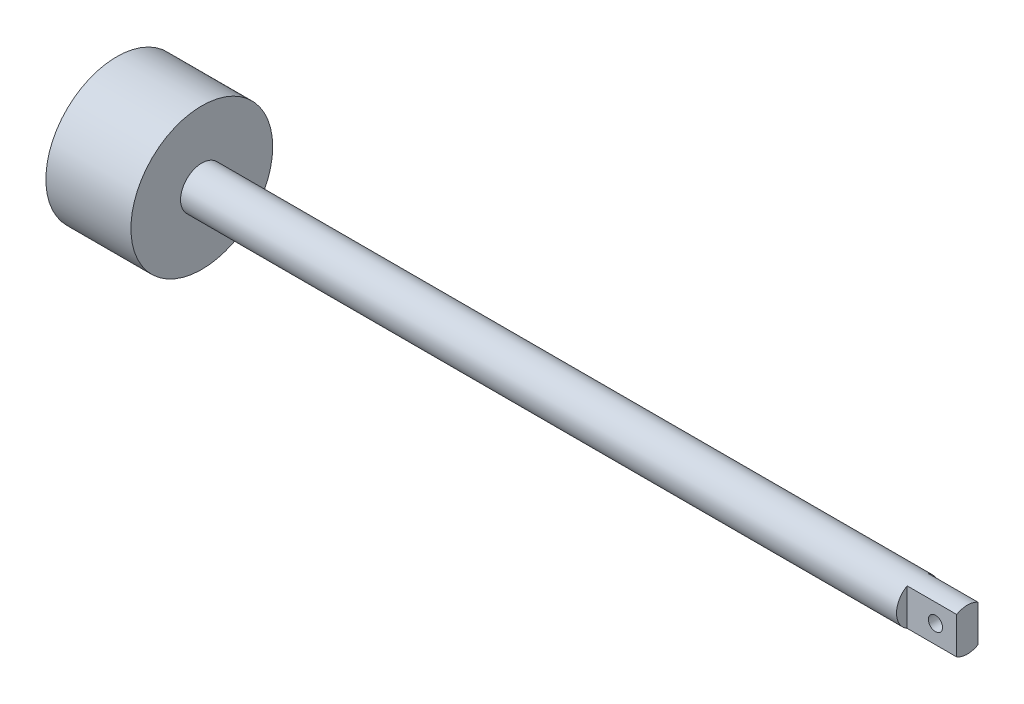
ISO-10303-21;
HEADER;
FILE_DESCRIPTION(('STEP AP214'),'2;1');
FILE_NAME('part.step','',(''),(''),'','','');
FILE_SCHEMA(('AUTOMOTIVE_DESIGN { 1 0 10303 214 1 1 1 1 }'));
ENDSEC;
DATA;
#1=APPLICATION_CONTEXT('core data for automotive mechanical design processes');
#2=APPLICATION_PROTOCOL_DEFINITION('international standard','automotive_design',2000,#1);
#3=PRODUCT_CONTEXT('',#1,'mechanical');
#4=PRODUCT('Part','Part','',(#3));
#5=PRODUCT_RELATED_PRODUCT_CATEGORY('part','',(#4));
#6=PRODUCT_DEFINITION_FORMATION('','',#4);
#7=PRODUCT_DEFINITION_CONTEXT('part definition',#1,'design');
#8=PRODUCT_DEFINITION('design','',#6,#7);
#9=PRODUCT_DEFINITION_SHAPE('','',#8);
#10=(LENGTH_UNIT() NAMED_UNIT(*) SI_UNIT(.MILLI.,.METRE.));
#11=(NAMED_UNIT(*) PLANE_ANGLE_UNIT() SI_UNIT($,.RADIAN.));
#12=(NAMED_UNIT(*) SI_UNIT($,.STERADIAN.) SOLID_ANGLE_UNIT());
#13=UNCERTAINTY_MEASURE_WITH_UNIT(LENGTH_MEASURE(1.E-05),#10,'distance_accuracy_value','');
#14=(GEOMETRIC_REPRESENTATION_CONTEXT(3) GLOBAL_UNCERTAINTY_ASSIGNED_CONTEXT((#13)) GLOBAL_UNIT_ASSIGNED_CONTEXT((#10,
#11,#12)) REPRESENTATION_CONTEXT('',''));
#15=CARTESIAN_POINT('',(0.,0.,0.));
#16=DIRECTION('',(0.,0.,1.));
#17=DIRECTION('',(1.,0.,0.));
#18=AXIS2_PLACEMENT_3D('',#15,#16,#17);
#19=CARTESIAN_POINT('',(60.,0.,0.));
#20=DIRECTION('',(-1.,0.,0.));
#21=DIRECTION('',(0.,0.,1.));
#22=AXIS2_PLACEMENT_3D('',#19,#20,#21);
#23=CYLINDRICAL_SURFACE('',#22,50.);
#24=CARTESIAN_POINT('',(60.,0.,0.));
#25=DIRECTION('',(1.,0.,0.));
#26=DIRECTION('',(0.,0.,-1.));
#27=AXIS2_PLACEMENT_3D('',#24,#25,#26);
#28=CIRCLE('',#27,50.);
#29=CARTESIAN_POINT('',(60.,0.,-50.));
#30=VERTEX_POINT('',#29);
#31=EDGE_CURVE('E11',#30,#30,#28,.T.);
#32=ORIENTED_EDGE('',*,*,#31,.F.);
#33=EDGE_LOOP('',(#32));
#34=FACE_BOUND('',#33,.T.);
#35=CARTESIAN_POINT('',(0.,0.,0.));
#36=DIRECTION('',(1.,0.,0.));
#37=DIRECTION('',(0.,0.,-1.));
#38=AXIS2_PLACEMENT_3D('',#35,#36,#37);
#39=CIRCLE('',#38,50.);
#40=CARTESIAN_POINT('',(0.,0.,-50.));
#41=VERTEX_POINT('',#40);
#42=EDGE_CURVE('E40',#41,#41,#39,.T.);
#43=ORIENTED_EDGE('',*,*,#42,.T.);
#44=EDGE_LOOP('',(#43));
#45=FACE_BOUND('',#44,.T.);
#46=ADVANCED_FACE('F37',(#34,#45),#23,.T.);
#47=CARTESIAN_POINT('',(60.,0.,0.));
#48=DIRECTION('',(1.,0.,0.));
#49=DIRECTION('',(0.,0.,-1.));
#50=AXIS2_PLACEMENT_3D('',#47,#48,#49);
#51=PLANE('',#50);
#52=CARTESIAN_POINT('',(59.9999999999999,0.,0.));
#53=DIRECTION('',(1.,0.,0.));
#54=DIRECTION('',(0.,0.,-1.));
#55=AXIS2_PLACEMENT_3D('',#52,#53,#54);
#56=CIRCLE('',#55,15.);
#57=CARTESIAN_POINT('',(59.9999999999999,0.,-15.));
#58=VERTEX_POINT('',#57);
#59=EDGE_CURVE('E99',#58,#58,#56,.F.);
#60=ORIENTED_EDGE('',*,*,#59,.T.);
#61=EDGE_LOOP('',(#60));
#62=FACE_BOUND('',#61,.T.);
#63=ORIENTED_EDGE('',*,*,#31,.T.);
#64=EDGE_LOOP('',(#63));
#65=FACE_BOUND('',#64,.T.);
#66=ADVANCED_FACE('F113',(#62,#65),#51,.T.);
#67=CARTESIAN_POINT('',(0.,0.,0.));
#68=DIRECTION('',(1.,0.,0.));
#69=DIRECTION('',(0.,0.,-1.));
#70=AXIS2_PLACEMENT_3D('',#67,#68,#69);
#71=PLANE('',#70);
#72=ORIENTED_EDGE('',*,*,#42,.F.);
#73=EDGE_LOOP('',(#72));
#74=FACE_BOUND('',#73,.T.);
#75=ADVANCED_FACE('F111',(#74),#71,.F.);
#76=CARTESIAN_POINT('',(600.,0.,0.));
#77=DIRECTION('',(-1.,0.,0.));
#78=DIRECTION('',(0.,0.,1.));
#79=AXIS2_PLACEMENT_3D('',#76,#77,#78);
#80=CYLINDRICAL_SURFACE('',#79,15.);
#81=CARTESIAN_POINT('',(600.,0.,0.));
#82=DIRECTION('',(1.,0.,0.));
#83=DIRECTION('',(0.,0.,-1.));
#84=AXIS2_PLACEMENT_3D('',#81,#82,#83);
#85=CIRCLE('',#84,15.);
#86=CARTESIAN_POINT('',(600.,12.9903810567666,-7.5));
#87=VERTEX_POINT('',#86);
#88=CARTESIAN_POINT('',(600.,12.9903810567666,7.5));
#89=VERTEX_POINT('',#88);
#90=EDGE_CURVE('E97',#87,#89,#85,.T.);
#91=ORIENTED_EDGE('',*,*,#90,.F.);
#92=DIRECTION('',(-1.,0.,0.));
#93=VECTOR('',#92,1.);
#94=CARTESIAN_POINT('',(600.,12.9903810567666,-7.5));
#95=LINE('',#94,#93);
#96=CARTESIAN_POINT('',(565.,12.9903810567666,-7.5));
#97=VERTEX_POINT('',#96);
#98=EDGE_CURVE('E59',#97,#87,#95,.F.);
#99=ORIENTED_EDGE('',*,*,#98,.F.);
#100=CARTESIAN_POINT('',(565.,0.,0.));
#101=DIRECTION('',(1.,0.,0.));
#102=DIRECTION('',(0.,0.,-1.));
#103=AXIS2_PLACEMENT_3D('',#100,#101,#102);
#104=CIRCLE('',#103,15.);
#105=CARTESIAN_POINT('',(565.,-12.9903810567666,-7.5));
#106=VERTEX_POINT('',#105);
#107=EDGE_CURVE('E93',#97,#106,#104,.F.);
#108=ORIENTED_EDGE('',*,*,#107,.T.);
#109=DIRECTION('',(-1.,0.,0.));
#110=VECTOR('',#109,1.);
#111=CARTESIAN_POINT('',(600.,-12.9903810567666,-7.5));
#112=LINE('',#111,#110);
#113=CARTESIAN_POINT('',(600.,-12.9903810567666,-7.5));
#114=VERTEX_POINT('',#113);
#115=EDGE_CURVE('E79',#106,#114,#112,.F.);
#116=ORIENTED_EDGE('',*,*,#115,.T.);
#117=CARTESIAN_POINT('',(600.,-12.9903810567666,7.5));
#118=VERTEX_POINT('',#117);
#119=EDGE_CURVE('E91',#118,#114,#85,.T.);
#120=ORIENTED_EDGE('',*,*,#119,.F.);
#121=DIRECTION('',(-1.,0.,0.));
#122=VECTOR('',#121,1.);
#123=CARTESIAN_POINT('',(600.,-12.9903810567666,7.5));
#124=LINE('',#123,#122);
#125=CARTESIAN_POINT('',(565.,-12.9903810567666,7.5));
#126=VERTEX_POINT('',#125);
#127=EDGE_CURVE('E51',#118,#126,#124,.T.);
#128=ORIENTED_EDGE('',*,*,#127,.T.);
#129=CARTESIAN_POINT('',(565.,0.,0.));
#130=DIRECTION('',(1.,0.,0.));
#131=DIRECTION('',(0.,0.,-1.));
#132=AXIS2_PLACEMENT_3D('',#129,#130,#131);
#133=CIRCLE('',#132,15.);
#134=CARTESIAN_POINT('',(565.,12.9903810567666,7.5));
#135=VERTEX_POINT('',#134);
#136=EDGE_CURVE('E214',#126,#135,#133,.F.);
#137=ORIENTED_EDGE('',*,*,#136,.T.);
#138=DIRECTION('',(-1.,0.,0.));
#139=VECTOR('',#138,1.);
#140=CARTESIAN_POINT('',(600.,12.9903810567666,7.5));
#141=LINE('',#140,#139);
#142=EDGE_CURVE('E217',#89,#135,#141,.T.);
#143=ORIENTED_EDGE('',*,*,#142,.F.);
#144=EDGE_LOOP('',(#91,#99,#108,#116,#120,#128,#137,#143));
#145=FACE_BOUND('',#144,.T.);
#146=ORIENTED_EDGE('',*,*,#59,.F.);
#147=EDGE_LOOP('',(#146));
#148=FACE_BOUND('',#147,.T.);
#149=ADVANCED_FACE('F89',(#145,#148),#80,.T.);
#150=CARTESIAN_POINT('',(600.,0.,0.));
#151=DIRECTION('',(1.,0.,0.));
#152=DIRECTION('',(0.,0.,-1.));
#153=AXIS2_PLACEMENT_3D('',#150,#151,#152);
#154=PLANE('',#153);
#155=DIRECTION('',(0.,-1.,0.));
#156=VECTOR('',#155,1.);
#157=CARTESIAN_POINT('',(600.,50.001,-7.5));
#158=LINE('',#157,#156);
#159=EDGE_CURVE('E76',#87,#114,#158,.T.);
#160=ORIENTED_EDGE('',*,*,#159,.F.);
#161=ORIENTED_EDGE('',*,*,#90,.T.);
#162=DIRECTION('',(0.,-1.,0.));
#163=VECTOR('',#162,1.);
#164=CARTESIAN_POINT('',(600.,50.001,7.5));
#165=LINE('',#164,#163);
#166=EDGE_CURVE('E94',#89,#118,#165,.T.);
#167=ORIENTED_EDGE('',*,*,#166,.T.);
#168=ORIENTED_EDGE('',*,*,#119,.T.);
#169=EDGE_LOOP('',(#160,#161,#167,#168));
#170=FACE_BOUND('',#169,.T.);
#171=ADVANCED_FACE('F96',(#170),#154,.T.);
#172=CARTESIAN_POINT('',(0.,50.001,7.5));
#173=DIRECTION('',(0.,0.,-1.));
#174=DIRECTION('',(-1.,0.,0.));
#175=AXIS2_PLACEMENT_3D('',#172,#173,#174);
#176=PLANE('',#175);
#177=CARTESIAN_POINT('',(585.,0.,7.5));
#178=DIRECTION('',(0.,0.,-1.));
#179=DIRECTION('',(-1.,0.,0.));
#180=AXIS2_PLACEMENT_3D('',#177,#178,#179);
#181=CIRCLE('',#180,5.00000000000004);
#182=CARTESIAN_POINT('',(580.,0.,7.5));
#183=VERTEX_POINT('',#182);
#184=EDGE_CURVE('E204',#183,#183,#181,.T.);
#185=ORIENTED_EDGE('',*,*,#184,.T.);
#186=EDGE_LOOP('',(#185));
#187=FACE_BOUND('',#186,.T.);
#188=ORIENTED_EDGE('',*,*,#142,.T.);
#189=DIRECTION('',(0.,-1.,0.));
#190=VECTOR('',#189,1.);
#191=CARTESIAN_POINT('',(565.,50.001,7.5));
#192=LINE('',#191,#190);
#193=EDGE_CURVE('E219',#135,#126,#192,.T.);
#194=ORIENTED_EDGE('',*,*,#193,.T.);
#195=ORIENTED_EDGE('',*,*,#127,.F.);
#196=ORIENTED_EDGE('',*,*,#166,.F.);
#197=EDGE_LOOP('',(#188,#194,#195,#196));
#198=FACE_BOUND('',#197,.T.);
#199=ADVANCED_FACE('F149',(#187,#198),#176,.F.);
#200=CARTESIAN_POINT('',(565.,50.001,0.));
#201=DIRECTION('',(1.,0.,0.));
#202=DIRECTION('',(0.,0.,-1.));
#203=AXIS2_PLACEMENT_3D('',#200,#201,#202);
#204=PLANE('',#203);
#205=ORIENTED_EDGE('',*,*,#193,.F.);
#206=ORIENTED_EDGE('',*,*,#136,.F.);
#207=EDGE_LOOP('',(#205,#206));
#208=FACE_BOUND('',#207,.T.);
#209=ADVANCED_FACE('F156',(#208),#204,.T.);
#210=CARTESIAN_POINT('',(565.,50.001,0.));
#211=DIRECTION('',(1.,0.,0.));
#212=DIRECTION('',(0.,0.,-1.));
#213=AXIS2_PLACEMENT_3D('',#210,#211,#212);
#214=PLANE('',#213);
#215=DIRECTION('',(0.,-1.,0.));
#216=VECTOR('',#215,1.);
#217=CARTESIAN_POINT('',(565.,50.001,-7.5));
#218=LINE('',#217,#216);
#219=EDGE_CURVE('E85',#97,#106,#218,.T.);
#220=ORIENTED_EDGE('',*,*,#219,.T.);
#221=ORIENTED_EDGE('',*,*,#107,.F.);
#222=EDGE_LOOP('',(#220,#221));
#223=FACE_BOUND('',#222,.T.);
#224=ADVANCED_FACE('F161',(#223),#214,.T.);
#225=CARTESIAN_POINT('',(0.,50.001,-7.49999999999994));
#226=DIRECTION('',(0.,0.,1.));
#227=DIRECTION('',(1.,0.,0.));
#228=AXIS2_PLACEMENT_3D('',#225,#226,#227);
#229=PLANE('',#228);
#230=CARTESIAN_POINT('',(585.,0.,-7.49999999999999));
#231=DIRECTION('',(0.,0.,1.));
#232=DIRECTION('',(1.,0.,0.));
#233=AXIS2_PLACEMENT_3D('',#230,#231,#232);
#234=CIRCLE('',#233,5.00000000000004);
#235=CARTESIAN_POINT('',(590.,0.,-7.49999999999999));
#236=VERTEX_POINT('',#235);
#237=EDGE_CURVE('E207',#236,#236,#234,.F.);
#238=ORIENTED_EDGE('',*,*,#237,.F.);
#239=EDGE_LOOP('',(#238));
#240=FACE_BOUND('',#239,.T.);
#241=ORIENTED_EDGE('',*,*,#98,.T.);
#242=ORIENTED_EDGE('',*,*,#159,.T.);
#243=ORIENTED_EDGE('',*,*,#115,.F.);
#244=ORIENTED_EDGE('',*,*,#219,.F.);
#245=EDGE_LOOP('',(#241,#242,#243,#244));
#246=FACE_BOUND('',#245,.T.);
#247=ADVANCED_FACE('F78',(#240,#246),#229,.F.);
#248=CARTESIAN_POINT('',(585.,0.,50.001));
#249=DIRECTION('',(0.,0.,-1.));
#250=DIRECTION('',(-1.,0.,0.));
#251=AXIS2_PLACEMENT_3D('',#248,#249,#250);
#252=CYLINDRICAL_SURFACE('',#251,5.00000000000004);
#253=ORIENTED_EDGE('',*,*,#184,.F.);
#254=EDGE_LOOP('',(#253));
#255=FACE_BOUND('',#254,.T.);
#256=ORIENTED_EDGE('',*,*,#237,.T.);
#257=EDGE_LOOP('',(#256));
#258=FACE_BOUND('',#257,.T.);
#259=ADVANCED_FACE('F187',(#255,#258),#252,.F.);
#260=CLOSED_SHELL('',(#46,#66,#75,#149,#171,#199,#209,#224,#247,#259));
#261=MANIFOLD_SOLID_BREP('B2',#260);
#262=ADVANCED_BREP_SHAPE_REPRESENTATION('',(#18,#261),#14);
#263=SHAPE_DEFINITION_REPRESENTATION(#9,#262);
ENDSEC;
END-ISO-10303-21;
